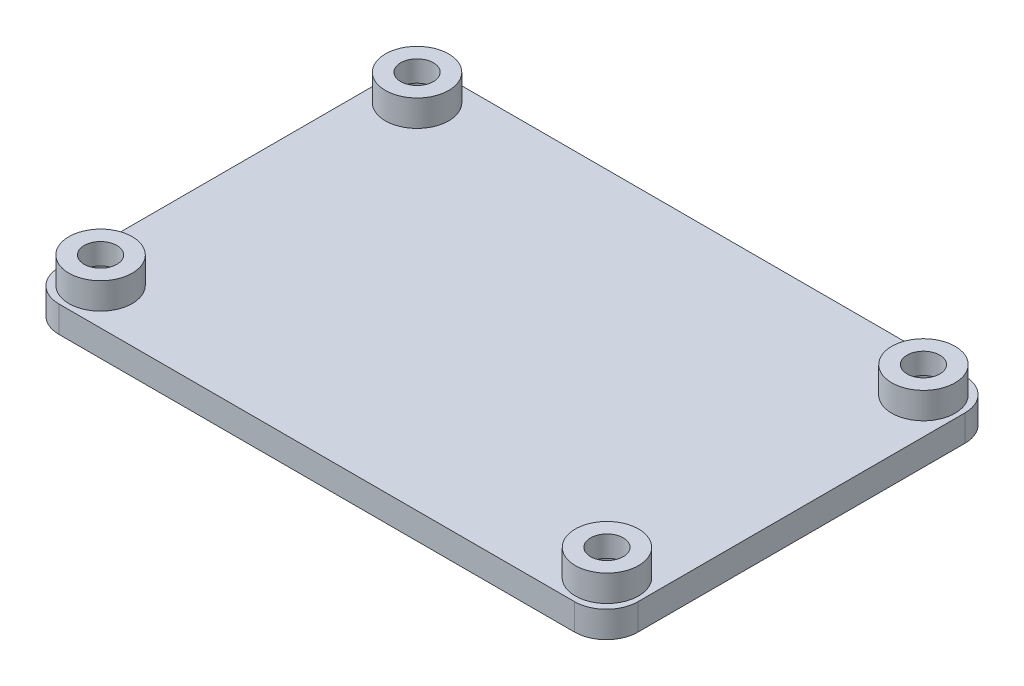
ISO-10303-21;
HEADER;
FILE_DESCRIPTION(('STEP AP214'),'2;1');
FILE_NAME('part.step','',(''),(''),'','','');
FILE_SCHEMA(('AUTOMOTIVE_DESIGN { 1 0 10303 214 1 1 1 1 }'));
ENDSEC;
DATA;
#1=APPLICATION_CONTEXT('core data for automotive mechanical design processes');
#2=APPLICATION_PROTOCOL_DEFINITION('international standard','automotive_design',2000,#1);
#3=PRODUCT_CONTEXT('',#1,'mechanical');
#4=PRODUCT('Part','Part','',(#3));
#5=PRODUCT_RELATED_PRODUCT_CATEGORY('part','',(#4));
#6=PRODUCT_DEFINITION_FORMATION('','',#4);
#7=PRODUCT_DEFINITION_CONTEXT('part definition',#1,'design');
#8=PRODUCT_DEFINITION('design','',#6,#7);
#9=PRODUCT_DEFINITION_SHAPE('','',#8);
#10=(LENGTH_UNIT() NAMED_UNIT(*) SI_UNIT(.MILLI.,.METRE.));
#11=(NAMED_UNIT(*) PLANE_ANGLE_UNIT() SI_UNIT($,.RADIAN.));
#12=(NAMED_UNIT(*) SI_UNIT($,.STERADIAN.) SOLID_ANGLE_UNIT());
#13=UNCERTAINTY_MEASURE_WITH_UNIT(LENGTH_MEASURE(1.E-05),#10,'distance_accuracy_value','');
#14=(GEOMETRIC_REPRESENTATION_CONTEXT(3) GLOBAL_UNCERTAINTY_ASSIGNED_CONTEXT((#13)) GLOBAL_UNIT_ASSIGNED_CONTEXT((#10,
#11,#12)) REPRESENTATION_CONTEXT('',''));
#15=CARTESIAN_POINT('',(0.,0.,0.));
#16=DIRECTION('',(0.,0.,1.));
#17=DIRECTION('',(1.,0.,0.));
#18=AXIS2_PLACEMENT_3D('',#15,#16,#17);
#19=CARTESIAN_POINT('',(24.,2.5,15.));
#20=DIRECTION('',(0.,-1.,0.));
#21=DIRECTION('',(0.,0.,-1.));
#22=AXIS2_PLACEMENT_3D('',#19,#20,#21);
#23=CYLINDRICAL_SURFACE('',#22,1.55);
#24=CARTESIAN_POINT('',(24.,5.,15.));
#25=DIRECTION('',(0.,-1.,0.));
#26=DIRECTION('',(0.,0.,-1.));
#27=AXIS2_PLACEMENT_3D('',#24,#25,#26);
#28=CIRCLE('',#27,1.55);
#29=CARTESIAN_POINT('',(24.,5.,13.45));
#30=VERTEX_POINT('',#29);
#31=EDGE_CURVE('E211',#30,#30,#28,.T.);
#32=ORIENTED_EDGE('',*,*,#31,.F.);
#33=EDGE_LOOP('',(#32));
#34=FACE_BOUND('',#33,.T.);
#35=CARTESIAN_POINT('',(24.,3.,15.));
#36=DIRECTION('',(0.,-1.,0.));
#37=DIRECTION('',(0.,0.,-1.));
#38=AXIS2_PLACEMENT_3D('',#35,#36,#37);
#39=CIRCLE('',#38,1.55);
#40=CARTESIAN_POINT('',(24.,3.,13.45));
#41=VERTEX_POINT('',#40);
#42=EDGE_CURVE('E189',#41,#41,#39,.T.);
#43=ORIENTED_EDGE('',*,*,#42,.T.);
#44=EDGE_LOOP('',(#43));
#45=FACE_BOUND('',#44,.T.);
#46=ADVANCED_FACE('F39',(#34,#45),#23,.F.);
#47=CARTESIAN_POINT('',(-24.,2.5,15.));
#48=DIRECTION('',(0.,-1.,0.));
#49=DIRECTION('',(0.,0.,-1.));
#50=AXIS2_PLACEMENT_3D('',#47,#48,#49);
#51=CYLINDRICAL_SURFACE('',#50,1.55);
#52=CARTESIAN_POINT('',(-24.,5.,15.));
#53=DIRECTION('',(0.,-1.,0.));
#54=DIRECTION('',(0.,0.,-1.));
#55=AXIS2_PLACEMENT_3D('',#52,#53,#54);
#56=CIRCLE('',#55,1.55);
#57=CARTESIAN_POINT('',(-24.,5.,13.45));
#58=VERTEX_POINT('',#57);
#59=EDGE_CURVE('E219',#58,#58,#56,.T.);
#60=ORIENTED_EDGE('',*,*,#59,.F.);
#61=EDGE_LOOP('',(#60));
#62=FACE_BOUND('',#61,.T.);
#63=CARTESIAN_POINT('',(-24.,3.,15.));
#64=DIRECTION('',(0.,-1.,0.));
#65=DIRECTION('',(0.,0.,-1.));
#66=AXIS2_PLACEMENT_3D('',#63,#64,#65);
#67=CIRCLE('',#66,1.55);
#68=CARTESIAN_POINT('',(-24.,3.,13.45));
#69=VERTEX_POINT('',#68);
#70=EDGE_CURVE('E185',#69,#69,#67,.T.);
#71=ORIENTED_EDGE('',*,*,#70,.T.);
#72=EDGE_LOOP('',(#71));
#73=FACE_BOUND('',#72,.T.);
#74=ADVANCED_FACE('F293',(#62,#73),#51,.F.);
#75=CARTESIAN_POINT('',(24.4365,2.5,15.5));
#76=DIRECTION('',(0.,1.,0.));
#77=DIRECTION('',(0.,0.,1.));
#78=AXIS2_PLACEMENT_3D('',#75,#76,#77);
#79=PLANE('',#78);
#80=CARTESIAN_POINT('',(24.,2.5,15.));
#81=DIRECTION('',(0.,1.,0.));
#82=DIRECTION('',(0.,0.,1.));
#83=AXIS2_PLACEMENT_3D('',#80,#81,#82);
#84=CIRCLE('',#83,3.);
#85=CARTESIAN_POINT('',(24.,2.5,18.));
#86=VERTEX_POINT('',#85);
#87=EDGE_CURVE('E224',#86,#86,#84,.T.);
#88=ORIENTED_EDGE('',*,*,#87,.F.);
#89=EDGE_LOOP('',(#88));
#90=FACE_BOUND('',#89,.T.);
#91=CARTESIAN_POINT('',(-24.,2.5,15.));
#92=DIRECTION('',(0.,1.,0.));
#93=DIRECTION('',(0.,0.,1.));
#94=AXIS2_PLACEMENT_3D('',#91,#92,#93);
#95=CIRCLE('',#94,3.);
#96=CARTESIAN_POINT('',(-24.,2.5,18.));
#97=VERTEX_POINT('',#96);
#98=EDGE_CURVE('E229',#97,#97,#95,.T.);
#99=ORIENTED_EDGE('',*,*,#98,.F.);
#100=EDGE_LOOP('',(#99));
#101=FACE_BOUND('',#100,.T.);
#102=CARTESIAN_POINT('',(24.,2.5,-15.));
#103=DIRECTION('',(0.,1.,0.));
#104=DIRECTION('',(0.,0.,1.));
#105=AXIS2_PLACEMENT_3D('',#102,#103,#104);
#106=CIRCLE('',#105,3.);
#107=CARTESIAN_POINT('',(24.,2.5,-12.));
#108=VERTEX_POINT('',#107);
#109=EDGE_CURVE('E237',#108,#108,#106,.T.);
#110=ORIENTED_EDGE('',*,*,#109,.F.);
#111=EDGE_LOOP('',(#110));
#112=FACE_BOUND('',#111,.T.);
#113=CARTESIAN_POINT('',(-24.,2.5,-15.));
#114=DIRECTION('',(0.,1.,0.));
#115=DIRECTION('',(0.,0.,1.));
#116=AXIS2_PLACEMENT_3D('',#113,#114,#115);
#117=CIRCLE('',#116,3.);
#118=CARTESIAN_POINT('',(-24.,2.5,-12.));
#119=VERTEX_POINT('',#118);
#120=EDGE_CURVE('E245',#119,#119,#117,.T.);
#121=ORIENTED_EDGE('',*,*,#120,.F.);
#122=EDGE_LOOP('',(#121));
#123=FACE_BOUND('',#122,.T.);
#124=DIRECTION('',(0.,0.,-1.));
#125=VECTOR('',#124,1.);
#126=CARTESIAN_POINT('',(27.4365,2.5,0.));
#127=LINE('',#126,#125);
#128=CARTESIAN_POINT('',(27.4365,2.5,15.5));
#129=VERTEX_POINT('',#128);
#130=CARTESIAN_POINT('',(27.4365,2.5,-15.5));
#131=VERTEX_POINT('',#130);
#132=EDGE_CURVE('E100',#129,#131,#127,.T.);
#133=ORIENTED_EDGE('',*,*,#132,.T.);
#134=CARTESIAN_POINT('',(24.4365,2.5,-15.5));
#135=DIRECTION('',(0.,1.,0.));
#136=DIRECTION('',(0.,0.,1.));
#137=AXIS2_PLACEMENT_3D('',#134,#135,#136);
#138=CIRCLE('',#137,3.);
#139=CARTESIAN_POINT('',(24.4365,2.5,-18.5));
#140=VERTEX_POINT('',#139);
#141=EDGE_CURVE('E257',#131,#140,#138,.T.);
#142=ORIENTED_EDGE('',*,*,#141,.T.);
#143=DIRECTION('',(-1.,0.,0.));
#144=VECTOR('',#143,1.);
#145=CARTESIAN_POINT('',(0.,2.5,-18.5));
#146=LINE('',#145,#144);
#147=CARTESIAN_POINT('',(-24.4365,2.5,-18.5));
#148=VERTEX_POINT('',#147);
#149=EDGE_CURVE('E260',#140,#148,#146,.T.);
#150=ORIENTED_EDGE('',*,*,#149,.T.);
#151=CARTESIAN_POINT('',(-24.4365,2.5,-15.5));
#152=DIRECTION('',(0.,1.,0.));
#153=DIRECTION('',(0.,0.,-1.));
#154=AXIS2_PLACEMENT_3D('',#151,#152,#153);
#155=CIRCLE('',#154,3.);
#156=CARTESIAN_POINT('',(-27.4365,2.5,-15.5));
#157=VERTEX_POINT('',#156);
#158=EDGE_CURVE('E263',#148,#157,#155,.T.);
#159=ORIENTED_EDGE('',*,*,#158,.T.);
#160=DIRECTION('',(0.,0.,1.));
#161=VECTOR('',#160,1.);
#162=CARTESIAN_POINT('',(-27.4365,2.5,0.));
#163=LINE('',#162,#161);
#164=CARTESIAN_POINT('',(-27.4365,2.5,15.5));
#165=VERTEX_POINT('',#164);
#166=EDGE_CURVE('E120',#157,#165,#163,.T.);
#167=ORIENTED_EDGE('',*,*,#166,.T.);
#168=CARTESIAN_POINT('',(-24.4365,2.5,15.5));
#169=DIRECTION('',(0.,1.,0.));
#170=DIRECTION('',(0.,0.,1.));
#171=AXIS2_PLACEMENT_3D('',#168,#169,#170);
#172=CIRCLE('',#171,3.00000000000001);
#173=CARTESIAN_POINT('',(-24.4365,2.5,18.5));
#174=VERTEX_POINT('',#173);
#175=EDGE_CURVE('E114',#165,#174,#172,.T.);
#176=ORIENTED_EDGE('',*,*,#175,.T.);
#177=DIRECTION('',(1.,0.,0.));
#178=VECTOR('',#177,1.);
#179=CARTESIAN_POINT('',(0.,2.5,18.5));
#180=LINE('',#179,#178);
#181=CARTESIAN_POINT('',(24.4365,2.5,18.5));
#182=VERTEX_POINT('',#181);
#183=EDGE_CURVE('E118',#174,#182,#180,.T.);
#184=ORIENTED_EDGE('',*,*,#183,.T.);
#185=CARTESIAN_POINT('',(24.4365,2.5,15.5));
#186=DIRECTION('',(0.,1.,0.));
#187=DIRECTION('',(0.,0.,1.));
#188=AXIS2_PLACEMENT_3D('',#185,#186,#187);
#189=CIRCLE('',#188,3.);
#190=EDGE_CURVE('E59',#182,#129,#189,.T.);
#191=ORIENTED_EDGE('',*,*,#190,.T.);
#192=EDGE_LOOP('',(#133,#142,#150,#159,#167,#176,#184,#191));
#193=FACE_BOUND('',#192,.T.);
#194=ADVANCED_FACE('F116',(#90,#101,#112,#123,#193),#79,.T.);
#195=CARTESIAN_POINT('',(24.4365,0.,15.5));
#196=DIRECTION('',(0.,1.,0.));
#197=DIRECTION('',(0.,0.,1.));
#198=AXIS2_PLACEMENT_3D('',#195,#196,#197);
#199=PLANE('',#198);
#200=CARTESIAN_POINT('',(-24.,0.,-15.));
#201=DIRECTION('',(0.,-1.,0.));
#202=DIRECTION('',(0.,0.,1.));
#203=AXIS2_PLACEMENT_3D('',#200,#201,#202);
#204=CIRCLE('',#203,2.1);
#205=CARTESIAN_POINT('',(-24.,0.,-12.9));
#206=VERTEX_POINT('',#205);
#207=EDGE_CURVE('E593',#206,#206,#204,.T.);
#208=ORIENTED_EDGE('',*,*,#207,.F.);
#209=EDGE_LOOP('',(#208));
#210=FACE_BOUND('',#209,.T.);
#211=CARTESIAN_POINT('',(24.,0.,-15.));
#212=DIRECTION('',(0.,-1.,0.));
#213=DIRECTION('',(0.,0.,1.));
#214=AXIS2_PLACEMENT_3D('',#211,#212,#213);
#215=CIRCLE('',#214,2.1);
#216=CARTESIAN_POINT('',(24.,0.,-12.9));
#217=VERTEX_POINT('',#216);
#218=EDGE_CURVE('E592',#217,#217,#215,.T.);
#219=ORIENTED_EDGE('',*,*,#218,.F.);
#220=EDGE_LOOP('',(#219));
#221=FACE_BOUND('',#220,.T.);
#222=CARTESIAN_POINT('',(24.,0.,15.));
#223=DIRECTION('',(0.,-1.,0.));
#224=DIRECTION('',(0.,0.,-1.));
#225=AXIS2_PLACEMENT_3D('',#222,#223,#224);
#226=CIRCLE('',#225,2.1);
#227=CARTESIAN_POINT('',(24.,0.,12.9));
#228=VERTEX_POINT('',#227);
#229=EDGE_CURVE('E614',#228,#228,#226,.T.);
#230=ORIENTED_EDGE('',*,*,#229,.F.);
#231=EDGE_LOOP('',(#230));
#232=FACE_BOUND('',#231,.T.);
#233=CARTESIAN_POINT('',(-24.,0.,15.));
#234=DIRECTION('',(0.,-1.,0.));
#235=DIRECTION('',(0.,0.,-1.));
#236=AXIS2_PLACEMENT_3D('',#233,#234,#235);
#237=CIRCLE('',#236,2.1);
#238=CARTESIAN_POINT('',(-24.,0.,12.9));
#239=VERTEX_POINT('',#238);
#240=EDGE_CURVE('E215',#239,#239,#237,.T.);
#241=ORIENTED_EDGE('',*,*,#240,.F.);
#242=EDGE_LOOP('',(#241));
#243=FACE_BOUND('',#242,.T.);
#244=DIRECTION('',(0.,0.,-1.));
#245=VECTOR('',#244,1.);
#246=CARTESIAN_POINT('',(27.4365,0.,0.));
#247=LINE('',#246,#245);
#248=CARTESIAN_POINT('',(27.4365,0.,15.5));
#249=VERTEX_POINT('',#248);
#250=CARTESIAN_POINT('',(27.4365,0.,-15.5));
#251=VERTEX_POINT('',#250);
#252=EDGE_CURVE('E94',#249,#251,#247,.T.);
#253=ORIENTED_EDGE('',*,*,#252,.F.);
#254=CARTESIAN_POINT('',(24.4365,0.,15.5));
#255=DIRECTION('',(0.,1.,0.));
#256=DIRECTION('',(0.,0.,1.));
#257=AXIS2_PLACEMENT_3D('',#254,#255,#256);
#258=CIRCLE('',#257,3.);
#259=CARTESIAN_POINT('',(24.4365,0.,18.5));
#260=VERTEX_POINT('',#259);
#261=EDGE_CURVE('E164',#260,#249,#258,.T.);
#262=ORIENTED_EDGE('',*,*,#261,.F.);
#263=DIRECTION('',(1.,0.,0.));
#264=VECTOR('',#263,1.);
#265=CARTESIAN_POINT('',(0.,0.,18.5));
#266=LINE('',#265,#264);
#267=CARTESIAN_POINT('',(-24.4365,0.,18.5));
#268=VERTEX_POINT('',#267);
#269=EDGE_CURVE('E87',#268,#260,#266,.T.);
#270=ORIENTED_EDGE('',*,*,#269,.F.);
#271=CARTESIAN_POINT('',(-24.4365,0.,15.5));
#272=DIRECTION('',(0.,1.,0.));
#273=DIRECTION('',(0.,0.,1.));
#274=AXIS2_PLACEMENT_3D('',#271,#272,#273);
#275=CIRCLE('',#274,3.00000000000001);
#276=CARTESIAN_POINT('',(-27.4365,0.,15.5));
#277=VERTEX_POINT('',#276);
#278=EDGE_CURVE('E130',#277,#268,#275,.T.);
#279=ORIENTED_EDGE('',*,*,#278,.F.);
#280=DIRECTION('',(0.,0.,1.));
#281=VECTOR('',#280,1.);
#282=CARTESIAN_POINT('',(-27.4365,0.,0.));
#283=LINE('',#282,#281);
#284=CARTESIAN_POINT('',(-27.4365,0.,-15.5));
#285=VERTEX_POINT('',#284);
#286=EDGE_CURVE('E157',#285,#277,#283,.T.);
#287=ORIENTED_EDGE('',*,*,#286,.F.);
#288=CARTESIAN_POINT('',(-24.4365,0.,-15.5));
#289=DIRECTION('',(0.,1.,0.));
#290=DIRECTION('',(0.,0.,-1.));
#291=AXIS2_PLACEMENT_3D('',#288,#289,#290);
#292=CIRCLE('',#291,3.);
#293=CARTESIAN_POINT('',(-24.4365,0.,-18.5));
#294=VERTEX_POINT('',#293);
#295=EDGE_CURVE('E153',#294,#285,#292,.T.);
#296=ORIENTED_EDGE('',*,*,#295,.F.);
#297=DIRECTION('',(-1.,0.,0.));
#298=VECTOR('',#297,1.);
#299=CARTESIAN_POINT('',(0.,0.,-18.5));
#300=LINE('',#299,#298);
#301=CARTESIAN_POINT('',(24.4365,0.,-18.5));
#302=VERTEX_POINT('',#301);
#303=EDGE_CURVE('E150',#302,#294,#300,.T.);
#304=ORIENTED_EDGE('',*,*,#303,.F.);
#305=CARTESIAN_POINT('',(24.4365,0.,-15.5));
#306=DIRECTION('',(0.,1.,0.));
#307=DIRECTION('',(0.,0.,1.));
#308=AXIS2_PLACEMENT_3D('',#305,#306,#307);
#309=CIRCLE('',#308,3.);
#310=EDGE_CURVE('E145',#251,#302,#309,.T.);
#311=ORIENTED_EDGE('',*,*,#310,.F.);
#312=EDGE_LOOP('',(#253,#262,#270,#279,#287,#296,#304,#311));
#313=FACE_BOUND('',#312,.T.);
#314=ADVANCED_FACE('F275',(#210,#221,#232,#243,#313),#199,.F.);
#315=CARTESIAN_POINT('',(27.4365,2.5,0.));
#316=DIRECTION('',(-1.,0.,0.));
#317=DIRECTION('',(0.,0.,1.));
#318=AXIS2_PLACEMENT_3D('',#315,#316,#317);
#319=PLANE('',#318);
#320=ORIENTED_EDGE('',*,*,#252,.T.);
#321=DIRECTION('',(0.,-1.,0.));
#322=VECTOR('',#321,1.);
#323=CARTESIAN_POINT('',(27.4365,2.5,-15.5));
#324=LINE('',#323,#322);
#325=EDGE_CURVE('E11',#131,#251,#324,.T.);
#326=ORIENTED_EDGE('',*,*,#325,.F.);
#327=ORIENTED_EDGE('',*,*,#132,.F.);
#328=DIRECTION('',(0.,-1.,0.));
#329=VECTOR('',#328,1.);
#330=CARTESIAN_POINT('',(27.4365,2.5,15.5));
#331=LINE('',#330,#329);
#332=EDGE_CURVE('E139',#129,#249,#331,.T.);
#333=ORIENTED_EDGE('',*,*,#332,.T.);
#334=EDGE_LOOP('',(#320,#326,#327,#333));
#335=FACE_BOUND('',#334,.T.);
#336=ADVANCED_FACE('F41',(#335),#319,.F.);
#337=CARTESIAN_POINT('',(24.4365,2.5,-15.5));
#338=DIRECTION('',(0.,-1.,0.));
#339=DIRECTION('',(0.,0.,-1.));
#340=AXIS2_PLACEMENT_3D('',#337,#338,#339);
#341=CYLINDRICAL_SURFACE('',#340,3.);
#342=ORIENTED_EDGE('',*,*,#310,.T.);
#343=DIRECTION('',(0.,-1.,0.));
#344=VECTOR('',#343,1.);
#345=CARTESIAN_POINT('',(24.4365,2.5,-18.5));
#346=LINE('',#345,#344);
#347=EDGE_CURVE('E50',#140,#302,#346,.T.);
#348=ORIENTED_EDGE('',*,*,#347,.F.);
#349=ORIENTED_EDGE('',*,*,#141,.F.);
#350=ORIENTED_EDGE('',*,*,#325,.T.);
#351=EDGE_LOOP('',(#342,#348,#349,#350));
#352=FACE_BOUND('',#351,.T.);
#353=ADVANCED_FACE('F282',(#352),#341,.T.);
#354=CARTESIAN_POINT('',(0.,2.5,-18.5));
#355=DIRECTION('',(0.,0.,1.));
#356=DIRECTION('',(1.,0.,0.));
#357=AXIS2_PLACEMENT_3D('',#354,#355,#356);
#358=PLANE('',#357);
#359=ORIENTED_EDGE('',*,*,#303,.T.);
#360=DIRECTION('',(0.,-1.,0.));
#361=VECTOR('',#360,1.);
#362=CARTESIAN_POINT('',(-24.4365,2.5,-18.5));
#363=LINE('',#362,#361);
#364=EDGE_CURVE('E178',#148,#294,#363,.T.);
#365=ORIENTED_EDGE('',*,*,#364,.F.);
#366=ORIENTED_EDGE('',*,*,#149,.F.);
#367=ORIENTED_EDGE('',*,*,#347,.T.);
#368=EDGE_LOOP('',(#359,#365,#366,#367));
#369=FACE_BOUND('',#368,.T.);
#370=ADVANCED_FACE('F284',(#369),#358,.F.);
#371=CARTESIAN_POINT('',(-24.4365,2.5,-15.5));
#372=DIRECTION('',(0.,-1.,0.));
#373=DIRECTION('',(0.,0.,-1.));
#374=AXIS2_PLACEMENT_3D('',#371,#372,#373);
#375=CYLINDRICAL_SURFACE('',#374,3.);
#376=ORIENTED_EDGE('',*,*,#295,.T.);
#377=DIRECTION('',(0.,-1.,0.));
#378=VECTOR('',#377,1.);
#379=CARTESIAN_POINT('',(-27.4365,2.5,-15.5));
#380=LINE('',#379,#378);
#381=EDGE_CURVE('E174',#157,#285,#380,.T.);
#382=ORIENTED_EDGE('',*,*,#381,.F.);
#383=ORIENTED_EDGE('',*,*,#158,.F.);
#384=ORIENTED_EDGE('',*,*,#364,.T.);
#385=EDGE_LOOP('',(#376,#382,#383,#384));
#386=FACE_BOUND('',#385,.T.);
#387=ADVANCED_FACE('F271',(#386),#375,.T.);
#388=CARTESIAN_POINT('',(-27.4365,2.5,0.));
#389=DIRECTION('',(1.,0.,0.));
#390=DIRECTION('',(0.,0.,-1.));
#391=AXIS2_PLACEMENT_3D('',#388,#389,#390);
#392=PLANE('',#391);
#393=ORIENTED_EDGE('',*,*,#286,.T.);
#394=DIRECTION('',(0.,-1.,0.));
#395=VECTOR('',#394,1.);
#396=CARTESIAN_POINT('',(-27.4365,2.5,15.5));
#397=LINE('',#396,#395);
#398=EDGE_CURVE('E132',#165,#277,#397,.T.);
#399=ORIENTED_EDGE('',*,*,#398,.F.);
#400=ORIENTED_EDGE('',*,*,#166,.F.);
#401=ORIENTED_EDGE('',*,*,#381,.T.);
#402=EDGE_LOOP('',(#393,#399,#400,#401));
#403=FACE_BOUND('',#402,.T.);
#404=ADVANCED_FACE('F274',(#403),#392,.F.);
#405=CARTESIAN_POINT('',(-24.4365,2.5,15.5));
#406=DIRECTION('',(0.,-1.,0.));
#407=DIRECTION('',(0.,0.,-1.));
#408=AXIS2_PLACEMENT_3D('',#405,#406,#407);
#409=CYLINDRICAL_SURFACE('',#408,3.00000000000001);
#410=ORIENTED_EDGE('',*,*,#278,.T.);
#411=DIRECTION('',(0.,-1.,0.));
#412=VECTOR('',#411,1.);
#413=CARTESIAN_POINT('',(-24.4365,2.5,18.5));
#414=LINE('',#413,#412);
#415=EDGE_CURVE('E127',#174,#268,#414,.T.);
#416=ORIENTED_EDGE('',*,*,#415,.F.);
#417=ORIENTED_EDGE('',*,*,#175,.F.);
#418=ORIENTED_EDGE('',*,*,#398,.T.);
#419=EDGE_LOOP('',(#410,#416,#417,#418));
#420=FACE_BOUND('',#419,.T.);
#421=ADVANCED_FACE('F128',(#420),#409,.T.);
#422=CARTESIAN_POINT('',(0.,2.5,18.5));
#423=DIRECTION('',(0.,0.,-1.));
#424=DIRECTION('',(-1.,0.,0.));
#425=AXIS2_PLACEMENT_3D('',#422,#423,#424);
#426=PLANE('',#425);
#427=ORIENTED_EDGE('',*,*,#269,.T.);
#428=DIRECTION('',(0.,-1.,0.));
#429=VECTOR('',#428,1.);
#430=CARTESIAN_POINT('',(24.4365,2.5,18.5));
#431=LINE('',#430,#429);
#432=EDGE_CURVE('E133',#182,#260,#431,.T.);
#433=ORIENTED_EDGE('',*,*,#432,.F.);
#434=ORIENTED_EDGE('',*,*,#183,.F.);
#435=ORIENTED_EDGE('',*,*,#415,.T.);
#436=EDGE_LOOP('',(#427,#433,#434,#435));
#437=FACE_BOUND('',#436,.T.);
#438=ADVANCED_FACE('F135',(#437),#426,.F.);
#439=CARTESIAN_POINT('',(24.4365,2.5,15.5));
#440=DIRECTION('',(0.,-1.,0.));
#441=DIRECTION('',(0.,0.,-1.));
#442=AXIS2_PLACEMENT_3D('',#439,#440,#441);
#443=CYLINDRICAL_SURFACE('',#442,3.);
#444=ORIENTED_EDGE('',*,*,#261,.T.);
#445=ORIENTED_EDGE('',*,*,#332,.F.);
#446=ORIENTED_EDGE('',*,*,#190,.F.);
#447=ORIENTED_EDGE('',*,*,#432,.T.);
#448=EDGE_LOOP('',(#444,#445,#446,#447));
#449=FACE_BOUND('',#448,.T.);
#450=ADVANCED_FACE('F277',(#449),#443,.T.);
#451=CARTESIAN_POINT('',(-24.,2.5,-15.));
#452=DIRECTION('',(0.,-1.,0.));
#453=DIRECTION('',(0.,0.,-1.));
#454=AXIS2_PLACEMENT_3D('',#451,#452,#453);
#455=CYLINDRICAL_SURFACE('',#454,1.55);
#456=CARTESIAN_POINT('',(-24.,3.,-15.));
#457=DIRECTION('',(0.,1.,0.));
#458=DIRECTION('',(0.,0.,1.));
#459=AXIS2_PLACEMENT_3D('',#456,#457,#458);
#460=CIRCLE('',#459,1.55);
#461=CARTESIAN_POINT('',(-24.,3.,-13.45));
#462=VERTEX_POINT('',#461);
#463=EDGE_CURVE('E43',#462,#462,#460,.T.);
#464=ORIENTED_EDGE('',*,*,#463,.F.);
#465=EDGE_LOOP('',(#464));
#466=FACE_BOUND('',#465,.T.);
#467=CARTESIAN_POINT('',(-24.,5.,-15.));
#468=DIRECTION('',(0.,-1.,0.));
#469=DIRECTION('',(0.,0.,-1.));
#470=AXIS2_PLACEMENT_3D('',#467,#468,#469);
#471=CIRCLE('',#470,1.55);
#472=CARTESIAN_POINT('',(-24.,5.,-16.55));
#473=VERTEX_POINT('',#472);
#474=EDGE_CURVE('E205',#473,#473,#471,.T.);
#475=ORIENTED_EDGE('',*,*,#474,.F.);
#476=EDGE_LOOP('',(#475));
#477=FACE_BOUND('',#476,.T.);
#478=ADVANCED_FACE('F309',(#466,#477),#455,.F.);
#479=CARTESIAN_POINT('',(24.,2.5,-15.));
#480=DIRECTION('',(0.,-1.,0.));
#481=DIRECTION('',(0.,0.,-1.));
#482=AXIS2_PLACEMENT_3D('',#479,#480,#481);
#483=CYLINDRICAL_SURFACE('',#482,1.55);
#484=CARTESIAN_POINT('',(24.,3.,-15.));
#485=DIRECTION('',(0.,1.,0.));
#486=DIRECTION('',(0.,0.,1.));
#487=AXIS2_PLACEMENT_3D('',#484,#485,#486);
#488=CIRCLE('',#487,1.55);
#489=CARTESIAN_POINT('',(24.,3.,-13.45));
#490=VERTEX_POINT('',#489);
#491=EDGE_CURVE('E193',#490,#490,#488,.T.);
#492=ORIENTED_EDGE('',*,*,#491,.F.);
#493=EDGE_LOOP('',(#492));
#494=FACE_BOUND('',#493,.T.);
#495=CARTESIAN_POINT('',(24.,5.,-15.));
#496=DIRECTION('',(0.,-1.,0.));
#497=DIRECTION('',(0.,0.,-1.));
#498=AXIS2_PLACEMENT_3D('',#495,#496,#497);
#499=CIRCLE('',#498,1.55);
#500=CARTESIAN_POINT('',(24.,5.,-16.55));
#501=VERTEX_POINT('',#500);
#502=EDGE_CURVE('E200',#501,#501,#499,.T.);
#503=ORIENTED_EDGE('',*,*,#502,.F.);
#504=EDGE_LOOP('',(#503));
#505=FACE_BOUND('',#504,.T.);
#506=ADVANCED_FACE('F305',(#494,#505),#483,.F.);
#507=CARTESIAN_POINT('',(-24.,5.,-15.));
#508=DIRECTION('',(0.,-1.,0.));
#509=DIRECTION('',(0.,0.,-1.));
#510=AXIS2_PLACEMENT_3D('',#507,#508,#509);
#511=CYLINDRICAL_SURFACE('',#510,3.);
#512=CARTESIAN_POINT('',(-24.,5.,-15.));
#513=DIRECTION('',(0.,1.,0.));
#514=DIRECTION('',(0.,0.,1.));
#515=AXIS2_PLACEMENT_3D('',#512,#513,#514);
#516=CIRCLE('',#515,3.);
#517=CARTESIAN_POINT('',(-24.,5.,-12.));
#518=VERTEX_POINT('',#517);
#519=EDGE_CURVE('E146',#518,#518,#516,.T.);
#520=ORIENTED_EDGE('',*,*,#519,.F.);
#521=EDGE_LOOP('',(#520));
#522=FACE_BOUND('',#521,.T.);
#523=ORIENTED_EDGE('',*,*,#120,.T.);
#524=EDGE_LOOP('',(#523));
#525=FACE_BOUND('',#524,.T.);
#526=ADVANCED_FACE('F308',(#522,#525),#511,.T.);
#527=CARTESIAN_POINT('',(-24.,5.,-15.));
#528=DIRECTION('',(0.,1.,0.));
#529=DIRECTION('',(0.,0.,1.));
#530=AXIS2_PLACEMENT_3D('',#527,#528,#529);
#531=PLANE('',#530);
#532=ORIENTED_EDGE('',*,*,#474,.T.);
#533=EDGE_LOOP('',(#532));
#534=FACE_BOUND('',#533,.T.);
#535=ORIENTED_EDGE('',*,*,#519,.T.);
#536=EDGE_LOOP('',(#535));
#537=FACE_BOUND('',#536,.T.);
#538=ADVANCED_FACE('F360',(#534,#537),#531,.T.);
#539=CARTESIAN_POINT('',(24.,5.,-15.));
#540=DIRECTION('',(0.,-1.,0.));
#541=DIRECTION('',(0.,0.,-1.));
#542=AXIS2_PLACEMENT_3D('',#539,#540,#541);
#543=CYLINDRICAL_SURFACE('',#542,3.);
#544=CARTESIAN_POINT('',(24.,5.,-15.));
#545=DIRECTION('',(0.,1.,0.));
#546=DIRECTION('',(0.,0.,1.));
#547=AXIS2_PLACEMENT_3D('',#544,#545,#546);
#548=CIRCLE('',#547,3.);
#549=CARTESIAN_POINT('',(24.,5.,-12.));
#550=VERTEX_POINT('',#549);
#551=EDGE_CURVE('E241',#550,#550,#548,.T.);
#552=ORIENTED_EDGE('',*,*,#551,.F.);
#553=EDGE_LOOP('',(#552));
#554=FACE_BOUND('',#553,.T.);
#555=ORIENTED_EDGE('',*,*,#109,.T.);
#556=EDGE_LOOP('',(#555));
#557=FACE_BOUND('',#556,.T.);
#558=ADVANCED_FACE('F368',(#554,#557),#543,.T.);
#559=CARTESIAN_POINT('',(24.,5.,-15.));
#560=DIRECTION('',(0.,1.,0.));
#561=DIRECTION('',(0.,0.,1.));
#562=AXIS2_PLACEMENT_3D('',#559,#560,#561);
#563=PLANE('',#562);
#564=ORIENTED_EDGE('',*,*,#502,.T.);
#565=EDGE_LOOP('',(#564));
#566=FACE_BOUND('',#565,.T.);
#567=ORIENTED_EDGE('',*,*,#551,.T.);
#568=EDGE_LOOP('',(#567));
#569=FACE_BOUND('',#568,.T.);
#570=ADVANCED_FACE('F377',(#566,#569),#563,.T.);
#571=CARTESIAN_POINT('',(-24.,5.,15.));
#572=DIRECTION('',(0.,-1.,0.));
#573=DIRECTION('',(0.,0.,-1.));
#574=AXIS2_PLACEMENT_3D('',#571,#572,#573);
#575=CYLINDRICAL_SURFACE('',#574,3.);
#576=CARTESIAN_POINT('',(-24.,5.,15.));
#577=DIRECTION('',(0.,1.,0.));
#578=DIRECTION('',(0.,0.,1.));
#579=AXIS2_PLACEMENT_3D('',#576,#577,#578);
#580=CIRCLE('',#579,3.);
#581=CARTESIAN_POINT('',(-24.,5.,18.));
#582=VERTEX_POINT('',#581);
#583=EDGE_CURVE('E233',#582,#582,#580,.T.);
#584=ORIENTED_EDGE('',*,*,#583,.F.);
#585=EDGE_LOOP('',(#584));
#586=FACE_BOUND('',#585,.T.);
#587=ORIENTED_EDGE('',*,*,#98,.T.);
#588=EDGE_LOOP('',(#587));
#589=FACE_BOUND('',#588,.T.);
#590=ADVANCED_FACE('F385',(#586,#589),#575,.T.);
#591=CARTESIAN_POINT('',(-24.,5.,15.));
#592=DIRECTION('',(0.,1.,0.));
#593=DIRECTION('',(0.,0.,1.));
#594=AXIS2_PLACEMENT_3D('',#591,#592,#593);
#595=PLANE('',#594);
#596=ORIENTED_EDGE('',*,*,#59,.T.);
#597=EDGE_LOOP('',(#596));
#598=FACE_BOUND('',#597,.T.);
#599=ORIENTED_EDGE('',*,*,#583,.T.);
#600=EDGE_LOOP('',(#599));
#601=FACE_BOUND('',#600,.T.);
#602=ADVANCED_FACE('F392',(#598,#601),#595,.T.);
#603=CARTESIAN_POINT('',(24.,5.,15.));
#604=DIRECTION('',(0.,-1.,0.));
#605=DIRECTION('',(0.,0.,-1.));
#606=AXIS2_PLACEMENT_3D('',#603,#604,#605);
#607=CYLINDRICAL_SURFACE('',#606,3.);
#608=CARTESIAN_POINT('',(24.,5.,15.));
#609=DIRECTION('',(0.,1.,0.));
#610=DIRECTION('',(0.,0.,1.));
#611=AXIS2_PLACEMENT_3D('',#608,#609,#610);
#612=CIRCLE('',#611,3.);
#613=CARTESIAN_POINT('',(24.,5.,18.));
#614=VERTEX_POINT('',#613);
#615=EDGE_CURVE('E225',#614,#614,#612,.T.);
#616=ORIENTED_EDGE('',*,*,#615,.F.);
#617=EDGE_LOOP('',(#616));
#618=FACE_BOUND('',#617,.T.);
#619=ORIENTED_EDGE('',*,*,#87,.T.);
#620=EDGE_LOOP('',(#619));
#621=FACE_BOUND('',#620,.T.);
#622=ADVANCED_FACE('F399',(#618,#621),#607,.T.);
#623=CARTESIAN_POINT('',(24.,5.,15.));
#624=DIRECTION('',(0.,1.,0.));
#625=DIRECTION('',(0.,0.,1.));
#626=AXIS2_PLACEMENT_3D('',#623,#624,#625);
#627=PLANE('',#626);
#628=ORIENTED_EDGE('',*,*,#31,.T.);
#629=EDGE_LOOP('',(#628));
#630=FACE_BOUND('',#629,.T.);
#631=ORIENTED_EDGE('',*,*,#615,.T.);
#632=EDGE_LOOP('',(#631));
#633=FACE_BOUND('',#632,.T.);
#634=ADVANCED_FACE('F407',(#630,#633),#627,.T.);
#635=CARTESIAN_POINT('',(-24.,3.,15.));
#636=DIRECTION('',(0.,-1.,0.));
#637=DIRECTION('',(0.,0.,-1.));
#638=AXIS2_PLACEMENT_3D('',#635,#636,#637);
#639=CYLINDRICAL_SURFACE('',#638,2.1);
#640=CARTESIAN_POINT('',(-24.,3.,15.));
#641=DIRECTION('',(0.,-1.,0.));
#642=DIRECTION('',(0.,0.,-1.));
#643=AXIS2_PLACEMENT_3D('',#640,#641,#642);
#644=CIRCLE('',#643,2.1);
#645=CARTESIAN_POINT('',(-24.,3.,12.9));
#646=VERTEX_POINT('',#645);
#647=EDGE_CURVE('E190',#646,#646,#644,.T.);
#648=ORIENTED_EDGE('',*,*,#647,.F.);
#649=EDGE_LOOP('',(#648));
#650=FACE_BOUND('',#649,.T.);
#651=ORIENTED_EDGE('',*,*,#240,.T.);
#652=EDGE_LOOP('',(#651));
#653=FACE_BOUND('',#652,.T.);
#654=ADVANCED_FACE('F414',(#650,#653),#639,.F.);
#655=CARTESIAN_POINT('',(-24.,3.,15.));
#656=DIRECTION('',(0.,-1.,0.));
#657=DIRECTION('',(0.,0.,-1.));
#658=AXIS2_PLACEMENT_3D('',#655,#656,#657);
#659=PLANE('',#658);
#660=ORIENTED_EDGE('',*,*,#70,.F.);
#661=EDGE_LOOP('',(#660));
#662=FACE_BOUND('',#661,.T.);
#663=ORIENTED_EDGE('',*,*,#647,.T.);
#664=EDGE_LOOP('',(#663));
#665=FACE_BOUND('',#664,.T.);
#666=ADVANCED_FACE('F421',(#662,#665),#659,.T.);
#667=CARTESIAN_POINT('',(24.,3.,15.));
#668=DIRECTION('',(0.,-1.,0.));
#669=DIRECTION('',(0.,0.,-1.));
#670=AXIS2_PLACEMENT_3D('',#667,#668,#669);
#671=CYLINDRICAL_SURFACE('',#670,2.1);
#672=CARTESIAN_POINT('',(24.,3.,15.));
#673=DIRECTION('',(0.,-1.,0.));
#674=DIRECTION('',(0.,0.,-1.));
#675=AXIS2_PLACEMENT_3D('',#672,#673,#674);
#676=CIRCLE('',#675,2.1);
#677=CARTESIAN_POINT('',(24.,3.,12.9));
#678=VERTEX_POINT('',#677);
#679=EDGE_CURVE('E609',#678,#678,#676,.T.);
#680=ORIENTED_EDGE('',*,*,#679,.F.);
#681=EDGE_LOOP('',(#680));
#682=FACE_BOUND('',#681,.T.);
#683=ORIENTED_EDGE('',*,*,#229,.T.);
#684=EDGE_LOOP('',(#683));
#685=FACE_BOUND('',#684,.T.);
#686=ADVANCED_FACE('F429',(#682,#685),#671,.F.);
#687=CARTESIAN_POINT('',(24.,3.,15.));
#688=DIRECTION('',(0.,-1.,0.));
#689=DIRECTION('',(0.,0.,-1.));
#690=AXIS2_PLACEMENT_3D('',#687,#688,#689);
#691=PLANE('',#690);
#692=ORIENTED_EDGE('',*,*,#42,.F.);
#693=EDGE_LOOP('',(#692));
#694=FACE_BOUND('',#693,.T.);
#695=ORIENTED_EDGE('',*,*,#679,.T.);
#696=EDGE_LOOP('',(#695));
#697=FACE_BOUND('',#696,.T.);
#698=ADVANCED_FACE('F437',(#694,#697),#691,.T.);
#699=CARTESIAN_POINT('',(24.,3.,-15.));
#700=DIRECTION('',(0.,-1.,0.));
#701=DIRECTION('',(0.,0.,-1.));
#702=AXIS2_PLACEMENT_3D('',#699,#700,#701);
#703=CYLINDRICAL_SURFACE('',#702,2.1);
#704=CARTESIAN_POINT('',(24.,3.,-15.));
#705=DIRECTION('',(0.,-1.,0.));
#706=DIRECTION('',(0.,0.,1.));
#707=AXIS2_PLACEMENT_3D('',#704,#705,#706);
#708=CIRCLE('',#707,2.1);
#709=CARTESIAN_POINT('',(24.,3.,-12.9));
#710=VERTEX_POINT('',#709);
#711=EDGE_CURVE('E598',#710,#710,#708,.T.);
#712=ORIENTED_EDGE('',*,*,#711,.F.);
#713=EDGE_LOOP('',(#712));
#714=FACE_BOUND('',#713,.T.);
#715=ORIENTED_EDGE('',*,*,#218,.T.);
#716=EDGE_LOOP('',(#715));
#717=FACE_BOUND('',#716,.T.);
#718=ADVANCED_FACE('F445',(#714,#717),#703,.F.);
#719=CARTESIAN_POINT('',(24.,3.,-15.));
#720=DIRECTION('',(0.,1.,0.));
#721=DIRECTION('',(0.,0.,1.));
#722=AXIS2_PLACEMENT_3D('',#719,#720,#721);
#723=PLANE('',#722);
#724=ORIENTED_EDGE('',*,*,#491,.T.);
#725=EDGE_LOOP('',(#724));
#726=FACE_BOUND('',#725,.T.);
#727=ORIENTED_EDGE('',*,*,#711,.T.);
#728=EDGE_LOOP('',(#727));
#729=FACE_BOUND('',#728,.T.);
#730=ADVANCED_FACE('F453',(#726,#729),#723,.F.);
#731=CARTESIAN_POINT('',(-24.,3.,-15.));
#732=DIRECTION('',(0.,-1.,0.));
#733=DIRECTION('',(0.,0.,-1.));
#734=AXIS2_PLACEMENT_3D('',#731,#732,#733);
#735=CYLINDRICAL_SURFACE('',#734,2.1);
#736=CARTESIAN_POINT('',(-24.,3.,-15.));
#737=DIRECTION('',(0.,-1.,0.));
#738=DIRECTION('',(0.,0.,1.));
#739=AXIS2_PLACEMENT_3D('',#736,#737,#738);
#740=CIRCLE('',#739,2.1);
#741=CARTESIAN_POINT('',(-24.,3.,-12.9));
#742=VERTEX_POINT('',#741);
#743=EDGE_CURVE('E590',#742,#742,#740,.T.);
#744=ORIENTED_EDGE('',*,*,#743,.F.);
#745=EDGE_LOOP('',(#744));
#746=FACE_BOUND('',#745,.T.);
#747=ORIENTED_EDGE('',*,*,#207,.T.);
#748=EDGE_LOOP('',(#747));
#749=FACE_BOUND('',#748,.T.);
#750=ADVANCED_FACE('F461',(#746,#749),#735,.F.);
#751=CARTESIAN_POINT('',(-24.,3.,-15.));
#752=DIRECTION('',(0.,1.,0.));
#753=DIRECTION('',(0.,0.,1.));
#754=AXIS2_PLACEMENT_3D('',#751,#752,#753);
#755=PLANE('',#754);
#756=ORIENTED_EDGE('',*,*,#463,.T.);
#757=EDGE_LOOP('',(#756));
#758=FACE_BOUND('',#757,.T.);
#759=ORIENTED_EDGE('',*,*,#743,.T.);
#760=EDGE_LOOP('',(#759));
#761=FACE_BOUND('',#760,.T.);
#762=ADVANCED_FACE('F468',(#758,#761),#755,.F.);
#763=CLOSED_SHELL('',(#46,#74,#194,#314,#336,#353,#370,#387,#404,#421,#438,#450,#478,#506,#526,
#538,#558,#570,#590,#602,#622,#634,#654,#666,#686,#698,#718,#730,#750,#762));
#764=MANIFOLD_SOLID_BREP('B2',#763);
#765=ADVANCED_BREP_SHAPE_REPRESENTATION('',(#18,#764),#14);
#766=SHAPE_DEFINITION_REPRESENTATION(#9,#765);
ENDSEC;
END-ISO-10303-21;
